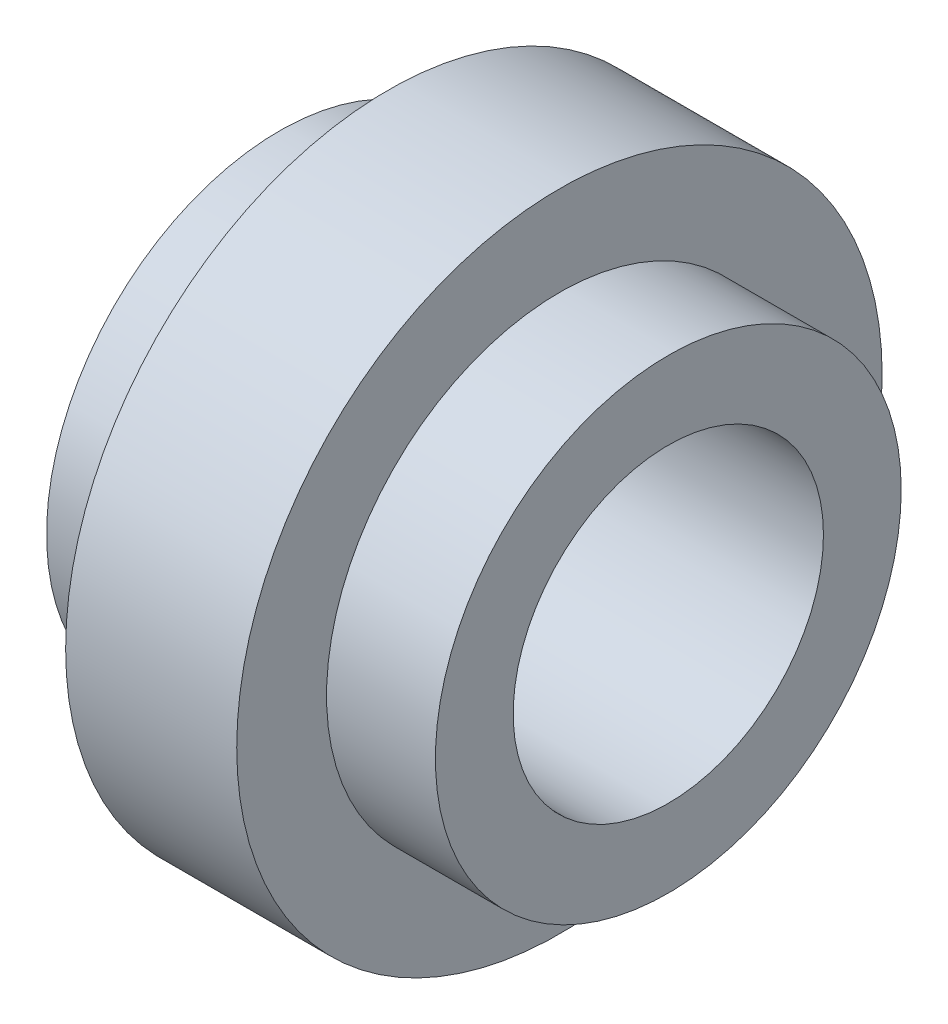
ISO-10303-21;
HEADER;
FILE_DESCRIPTION(('STEP AP214'),'2;1');
FILE_NAME('part.step','',(''),(''),'','','');
FILE_SCHEMA(('AUTOMOTIVE_DESIGN { 1 0 10303 214 1 1 1 1 }'));
ENDSEC;
DATA;
#1=APPLICATION_CONTEXT('core data for automotive mechanical design processes');
#2=APPLICATION_PROTOCOL_DEFINITION('international standard','automotive_design',2000,#1);
#3=PRODUCT_CONTEXT('',#1,'mechanical');
#4=PRODUCT('Part','Part','',(#3));
#5=PRODUCT_RELATED_PRODUCT_CATEGORY('part','',(#4));
#6=PRODUCT_DEFINITION_FORMATION('','',#4);
#7=PRODUCT_DEFINITION_CONTEXT('part definition',#1,'design');
#8=PRODUCT_DEFINITION('design','',#6,#7);
#9=PRODUCT_DEFINITION_SHAPE('','',#8);
#10=(LENGTH_UNIT() NAMED_UNIT(*) SI_UNIT(.MILLI.,.METRE.));
#11=(NAMED_UNIT(*) PLANE_ANGLE_UNIT() SI_UNIT($,.RADIAN.));
#12=(NAMED_UNIT(*) SI_UNIT($,.STERADIAN.) SOLID_ANGLE_UNIT());
#13=UNCERTAINTY_MEASURE_WITH_UNIT(LENGTH_MEASURE(1.E-05),#10,'distance_accuracy_value','');
#14=(GEOMETRIC_REPRESENTATION_CONTEXT(3) GLOBAL_UNCERTAINTY_ASSIGNED_CONTEXT((#13)) GLOBAL_UNIT_ASSIGNED_CONTEXT((#10,
#11,#12)) REPRESENTATION_CONTEXT('',''));
#15=CARTESIAN_POINT('',(0.,0.,0.));
#16=DIRECTION('',(0.,0.,1.));
#17=DIRECTION('',(1.,0.,0.));
#18=AXIS2_PLACEMENT_3D('',#15,#16,#17);
#19=CARTESIAN_POINT('',(25.,0.,0.));
#20=DIRECTION('',(-1.,0.,0.));
#21=DIRECTION('',(0.,0.,1.));
#22=AXIS2_PLACEMENT_3D('',#19,#20,#21);
#23=CYLINDRICAL_SURFACE('',#22,14.975);
#24=CARTESIAN_POINT('',(0.,0.,0.));
#25=DIRECTION('',(1.,0.,0.));
#26=DIRECTION('',(0.,0.,-1.));
#27=AXIS2_PLACEMENT_3D('',#24,#25,#26);
#28=CIRCLE('',#27,14.975);
#29=CARTESIAN_POINT('',(0.,0.,-14.975));
#30=VERTEX_POINT('',#29);
#31=EDGE_CURVE('E47',#30,#30,#28,.T.);
#32=ORIENTED_EDGE('',*,*,#31,.T.);
#33=EDGE_LOOP('',(#32));
#34=FACE_BOUND('',#33,.T.);
#35=CARTESIAN_POINT('',(7.,0.,0.));
#36=DIRECTION('',(1.,0.,0.));
#37=DIRECTION('',(0.,0.,-1.));
#38=AXIS2_PLACEMENT_3D('',#35,#36,#37);
#39=CIRCLE('',#38,14.975);
#40=CARTESIAN_POINT('',(7.,0.,-14.975));
#41=VERTEX_POINT('',#40);
#42=EDGE_CURVE('E10',#41,#41,#39,.T.);
#43=ORIENTED_EDGE('',*,*,#42,.F.);
#44=EDGE_LOOP('',(#43));
#45=FACE_BOUND('',#44,.T.);
#46=ADVANCED_FACE('F43',(#34,#45),#23,.T.);
#47=CARTESIAN_POINT('',(25.,0.,0.));
#48=DIRECTION('',(1.,0.,0.));
#49=DIRECTION('',(0.,0.,-1.));
#50=AXIS2_PLACEMENT_3D('',#47,#48,#49);
#51=PLANE('',#50);
#52=CARTESIAN_POINT('',(25.,0.,0.));
#53=DIRECTION('',(1.,0.,0.));
#54=DIRECTION('',(0.,0.,-1.));
#55=AXIS2_PLACEMENT_3D('',#52,#53,#54);
#56=CIRCLE('',#55,14.975);
#57=CARTESIAN_POINT('',(25.,0.,-14.975));
#58=VERTEX_POINT('',#57);
#59=EDGE_CURVE('E52',#58,#58,#56,.T.);
#60=ORIENTED_EDGE('',*,*,#59,.T.);
#61=EDGE_LOOP('',(#60));
#62=FACE_BOUND('',#61,.T.);
#63=CARTESIAN_POINT('',(25.,0.,0.));
#64=DIRECTION('',(1.,0.,0.));
#65=DIRECTION('',(0.,0.,-1.));
#66=AXIS2_PLACEMENT_3D('',#63,#64,#65);
#67=CIRCLE('',#66,9.97500000000073);
#68=CARTESIAN_POINT('',(25.,0.,-9.97500000000073));
#69=VERTEX_POINT('',#68);
#70=EDGE_CURVE('E62',#69,#69,#67,.T.);
#71=ORIENTED_EDGE('',*,*,#70,.F.);
#72=EDGE_LOOP('',(#71));
#73=FACE_BOUND('',#72,.T.);
#74=ADVANCED_FACE('F100',(#62,#73),#51,.T.);
#75=CARTESIAN_POINT('',(0.,0.,0.));
#76=DIRECTION('',(1.,0.,0.));
#77=DIRECTION('',(0.,0.,-1.));
#78=AXIS2_PLACEMENT_3D('',#75,#76,#77);
#79=PLANE('',#78);
#80=ORIENTED_EDGE('',*,*,#31,.F.);
#81=EDGE_LOOP('',(#80));
#82=FACE_BOUND('',#81,.T.);
#83=CARTESIAN_POINT('',(0.,0.,0.));
#84=DIRECTION('',(1.,0.,0.));
#85=DIRECTION('',(0.,0.,-1.));
#86=AXIS2_PLACEMENT_3D('',#83,#84,#85);
#87=CIRCLE('',#86,9.97500000000073);
#88=CARTESIAN_POINT('',(0.,0.,-9.97500000000073));
#89=VERTEX_POINT('',#88);
#90=EDGE_CURVE('E66',#89,#89,#87,.T.);
#91=ORIENTED_EDGE('',*,*,#90,.T.);
#92=EDGE_LOOP('',(#91));
#93=FACE_BOUND('',#92,.T.);
#94=ADVANCED_FACE('F107',(#82,#93),#79,.F.);
#95=CARTESIAN_POINT('',(18.,0.,0.));
#96=DIRECTION('',(1.,0.,0.));
#97=DIRECTION('',(0.,0.,-1.));
#98=AXIS2_PLACEMENT_3D('',#95,#96,#97);
#99=CIRCLE('',#98,14.975);
#100=CARTESIAN_POINT('',(18.,0.,-14.975));
#101=VERTEX_POINT('',#100);
#102=EDGE_CURVE('E60',#101,#101,#99,.T.);
#103=ORIENTED_EDGE('',*,*,#102,.T.);
#104=EDGE_LOOP('',(#103));
#105=FACE_BOUND('',#104,.T.);
#106=ORIENTED_EDGE('',*,*,#59,.F.);
#107=EDGE_LOOP('',(#106));
#108=FACE_BOUND('',#107,.T.);
#109=ADVANCED_FACE('F45',(#105,#108),#23,.T.);
#110=CARTESIAN_POINT('',(25.,0.,0.));
#111=DIRECTION('',(-1.,0.,0.));
#112=DIRECTION('',(0.,0.,1.));
#113=AXIS2_PLACEMENT_3D('',#110,#111,#112);
#114=CYLINDRICAL_SURFACE('',#113,9.97500000000073);
#115=ORIENTED_EDGE('',*,*,#70,.T.);
#116=EDGE_LOOP('',(#115));
#117=FACE_BOUND('',#116,.T.);
#118=ORIENTED_EDGE('',*,*,#90,.F.);
#119=EDGE_LOOP('',(#118));
#120=FACE_BOUND('',#119,.T.);
#121=ADVANCED_FACE('F112',(#117,#120),#114,.F.);
#122=CARTESIAN_POINT('',(7.,0.,0.));
#123=DIRECTION('',(1.,0.,0.));
#124=DIRECTION('',(0.,0.,-1.));
#125=AXIS2_PLACEMENT_3D('',#122,#123,#124);
#126=PLANE('',#125);
#127=CARTESIAN_POINT('',(7.,0.,0.));
#128=DIRECTION('',(1.,0.,0.));
#129=DIRECTION('',(0.,0.,-1.));
#130=AXIS2_PLACEMENT_3D('',#127,#128,#129);
#131=CIRCLE('',#130,20.75);
#132=CARTESIAN_POINT('',(7.,0.,-20.75));
#133=VERTEX_POINT('',#132);
#134=EDGE_CURVE('E73',#133,#133,#131,.T.);
#135=ORIENTED_EDGE('',*,*,#134,.F.);
#136=EDGE_LOOP('',(#135));
#137=FACE_BOUND('',#136,.T.);
#138=ORIENTED_EDGE('',*,*,#42,.T.);
#139=EDGE_LOOP('',(#138));
#140=FACE_BOUND('',#139,.T.);
#141=ADVANCED_FACE('F95',(#137,#140),#126,.F.);
#142=CARTESIAN_POINT('',(18.,0.,0.));
#143=DIRECTION('',(1.,0.,0.));
#144=DIRECTION('',(0.,0.,-1.));
#145=AXIS2_PLACEMENT_3D('',#142,#143,#144);
#146=PLANE('',#145);
#147=CARTESIAN_POINT('',(18.,0.,0.));
#148=DIRECTION('',(1.,0.,0.));
#149=DIRECTION('',(0.,0.,-1.));
#150=AXIS2_PLACEMENT_3D('',#147,#148,#149);
#151=CIRCLE('',#150,20.75);
#152=CARTESIAN_POINT('',(18.,0.,-20.75));
#153=VERTEX_POINT('',#152);
#154=EDGE_CURVE('E78',#153,#153,#151,.T.);
#155=ORIENTED_EDGE('',*,*,#154,.T.);
#156=EDGE_LOOP('',(#155));
#157=FACE_BOUND('',#156,.T.);
#158=ORIENTED_EDGE('',*,*,#102,.F.);
#159=EDGE_LOOP('',(#158));
#160=FACE_BOUND('',#159,.T.);
#161=ADVANCED_FACE('F86',(#157,#160),#146,.T.);
#162=CARTESIAN_POINT('',(7.,0.,0.));
#163=DIRECTION('',(1.,0.,0.));
#164=DIRECTION('',(0.,0.,-1.));
#165=AXIS2_PLACEMENT_3D('',#162,#163,#164);
#166=CYLINDRICAL_SURFACE('',#165,20.75);
#167=ORIENTED_EDGE('',*,*,#134,.T.);
#168=EDGE_LOOP('',(#167));
#169=FACE_BOUND('',#168,.T.);
#170=ORIENTED_EDGE('',*,*,#154,.F.);
#171=EDGE_LOOP('',(#170));
#172=FACE_BOUND('',#171,.T.);
#173=ADVANCED_FACE('F89',(#169,#172),#166,.T.);
#174=CLOSED_SHELL('',(#46,#74,#94,#109,#121,#141,#161,#173));
#175=MANIFOLD_SOLID_BREP('B2',#174);
#176=ADVANCED_BREP_SHAPE_REPRESENTATION('',(#18,#175),#14);
#177=SHAPE_DEFINITION_REPRESENTATION(#9,#176);
ENDSEC;
END-ISO-10303-21;
